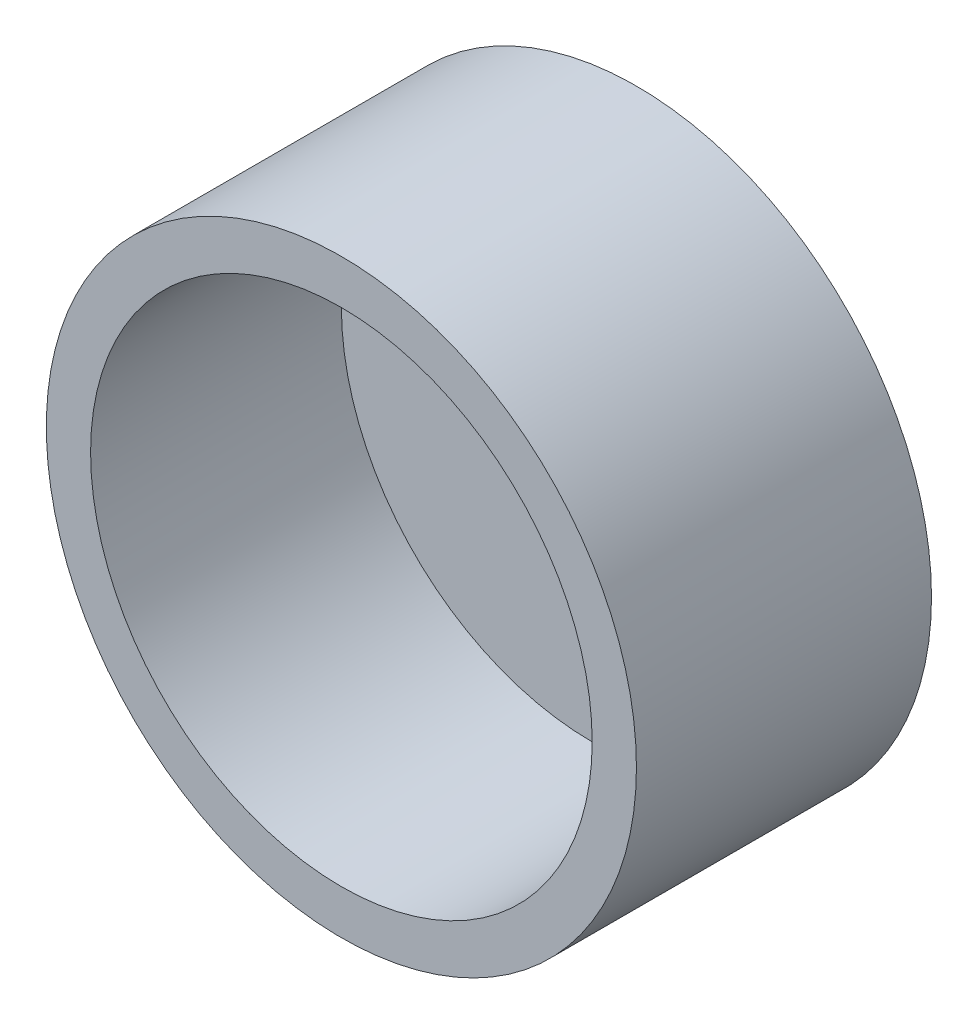
ISO-10303-21;
HEADER;
FILE_DESCRIPTION(('STEP AP214'),'2;1');
FILE_NAME('part.step','',(''),(''),'','','');
FILE_SCHEMA(('AUTOMOTIVE_DESIGN { 1 0 10303 214 1 1 1 1 }'));
ENDSEC;
DATA;
#1=APPLICATION_CONTEXT('core data for automotive mechanical design processes');
#2=APPLICATION_PROTOCOL_DEFINITION('international standard','automotive_design',2000,#1);
#3=PRODUCT_CONTEXT('',#1,'mechanical');
#4=PRODUCT('Part','Part','',(#3));
#5=PRODUCT_RELATED_PRODUCT_CATEGORY('part','',(#4));
#6=PRODUCT_DEFINITION_FORMATION('','',#4);
#7=PRODUCT_DEFINITION_CONTEXT('part definition',#1,'design');
#8=PRODUCT_DEFINITION('design','',#6,#7);
#9=PRODUCT_DEFINITION_SHAPE('','',#8);
#10=(LENGTH_UNIT() NAMED_UNIT(*) SI_UNIT(.MILLI.,.METRE.));
#11=(NAMED_UNIT(*) PLANE_ANGLE_UNIT() SI_UNIT($,.RADIAN.));
#12=(NAMED_UNIT(*) SI_UNIT($,.STERADIAN.) SOLID_ANGLE_UNIT());
#13=UNCERTAINTY_MEASURE_WITH_UNIT(LENGTH_MEASURE(1.E-05),#10,'distance_accuracy_value','');
#14=(GEOMETRIC_REPRESENTATION_CONTEXT(3) GLOBAL_UNCERTAINTY_ASSIGNED_CONTEXT((#13)) GLOBAL_UNIT_ASSIGNED_CONTEXT((#10,
#11,#12)) REPRESENTATION_CONTEXT('',''));
#15=CARTESIAN_POINT('',(0.,0.,0.));
#16=DIRECTION('',(0.,0.,1.));
#17=DIRECTION('',(1.,0.,0.));
#18=AXIS2_PLACEMENT_3D('',#15,#16,#17);
#19=CARTESIAN_POINT('',(0.,0.,40.));
#20=DIRECTION('',(0.,0.,-1.));
#21=DIRECTION('',(-1.,0.,0.));
#22=AXIS2_PLACEMENT_3D('',#19,#20,#21);
#23=CYLINDRICAL_SURFACE('',#22,40.);
#24=CARTESIAN_POINT('',(0.,0.,40.));
#25=DIRECTION('',(0.,0.,1.));
#26=DIRECTION('',(1.,0.,0.));
#27=AXIS2_PLACEMENT_3D('',#24,#25,#26);
#28=CIRCLE('',#27,40.);
#29=CARTESIAN_POINT('',(40.,0.,40.));
#30=VERTEX_POINT('',#29);
#31=EDGE_CURVE('E10',#30,#30,#28,.T.);
#32=ORIENTED_EDGE('',*,*,#31,.F.);
#33=EDGE_LOOP('',(#32));
#34=FACE_BOUND('',#33,.T.);
#35=CARTESIAN_POINT('',(0.,0.,0.));
#36=DIRECTION('',(0.,0.,1.));
#37=DIRECTION('',(1.,0.,0.));
#38=AXIS2_PLACEMENT_3D('',#35,#36,#37);
#39=CIRCLE('',#38,40.);
#40=CARTESIAN_POINT('',(40.,0.,0.));
#41=VERTEX_POINT('',#40);
#42=EDGE_CURVE('E53',#41,#41,#39,.T.);
#43=ORIENTED_EDGE('',*,*,#42,.T.);
#44=EDGE_LOOP('',(#43));
#45=FACE_BOUND('',#44,.T.);
#46=ADVANCED_FACE('F49',(#34,#45),#23,.T.);
#47=CARTESIAN_POINT('',(0.,0.,40.));
#48=DIRECTION('',(0.,0.,1.));
#49=DIRECTION('',(1.,0.,0.));
#50=AXIS2_PLACEMENT_3D('',#47,#48,#49);
#51=PLANE('',#50);
#52=CARTESIAN_POINT('',(0.,0.,40.));
#53=DIRECTION('',(0.,0.,1.));
#54=DIRECTION('',(1.,0.,0.));
#55=AXIS2_PLACEMENT_3D('',#52,#53,#54);
#56=CIRCLE('',#55,34.);
#57=CARTESIAN_POINT('',(34.,0.,40.));
#58=VERTEX_POINT('',#57);
#59=EDGE_CURVE('E65',#58,#58,#56,.T.);
#60=ORIENTED_EDGE('',*,*,#59,.F.);
#61=EDGE_LOOP('',(#60));
#62=FACE_BOUND('',#61,.T.);
#63=ORIENTED_EDGE('',*,*,#31,.T.);
#64=EDGE_LOOP('',(#63));
#65=FACE_BOUND('',#64,.T.);
#66=ADVANCED_FACE('F81',(#62,#65),#51,.T.);
#67=CARTESIAN_POINT('',(0.,0.,0.));
#68=DIRECTION('',(0.,0.,1.));
#69=DIRECTION('',(1.,0.,0.));
#70=AXIS2_PLACEMENT_3D('',#67,#68,#69);
#71=PLANE('',#70);
#72=ORIENTED_EDGE('',*,*,#42,.F.);
#73=EDGE_LOOP('',(#72));
#74=FACE_BOUND('',#73,.T.);
#75=ADVANCED_FACE('F77',(#74),#71,.F.);
#76=CARTESIAN_POINT('',(0.,0.,6.));
#77=DIRECTION('',(0.,0.,1.));
#78=DIRECTION('',(1.,0.,0.));
#79=AXIS2_PLACEMENT_3D('',#76,#77,#78);
#80=CYLINDRICAL_SURFACE('',#79,34.);
#81=CARTESIAN_POINT('',(0.,0.,6.));
#82=DIRECTION('',(0.,0.,1.));
#83=DIRECTION('',(1.,0.,0.));
#84=AXIS2_PLACEMENT_3D('',#81,#82,#83);
#85=CIRCLE('',#84,34.);
#86=CARTESIAN_POINT('',(34.,0.,6.));
#87=VERTEX_POINT('',#86);
#88=EDGE_CURVE('E63',#87,#87,#85,.T.);
#89=ORIENTED_EDGE('',*,*,#88,.F.);
#90=EDGE_LOOP('',(#89));
#91=FACE_BOUND('',#90,.T.);
#92=ORIENTED_EDGE('',*,*,#59,.T.);
#93=EDGE_LOOP('',(#92));
#94=FACE_BOUND('',#93,.T.);
#95=ADVANCED_FACE('F74',(#91,#94),#80,.F.);
#96=CARTESIAN_POINT('',(0.,0.,6.));
#97=DIRECTION('',(0.,0.,1.));
#98=DIRECTION('',(1.,0.,0.));
#99=AXIS2_PLACEMENT_3D('',#96,#97,#98);
#100=PLANE('',#99);
#101=ORIENTED_EDGE('',*,*,#88,.T.);
#102=EDGE_LOOP('',(#101));
#103=FACE_BOUND('',#102,.T.);
#104=ADVANCED_FACE('F72',(#103),#100,.T.);
#105=CLOSED_SHELL('',(#46,#66,#75,#95,#104));
#106=MANIFOLD_SOLID_BREP('B2',#105);
#107=ADVANCED_BREP_SHAPE_REPRESENTATION('',(#18,#106),#14);
#108=SHAPE_DEFINITION_REPRESENTATION(#9,#107);
ENDSEC;
END-ISO-10303-21;
